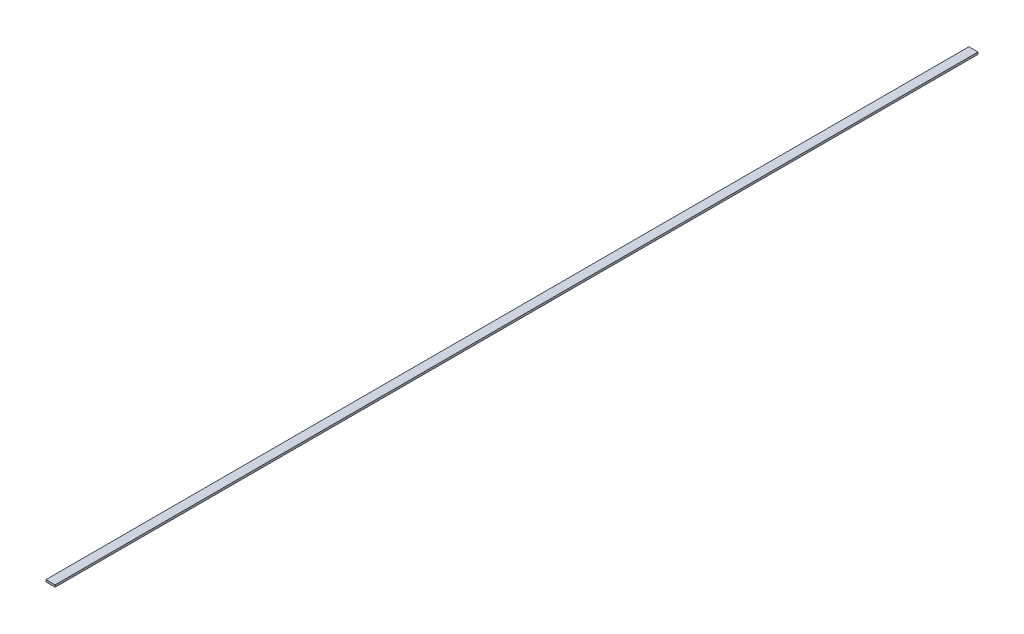
ISO-10303-21;
HEADER;
FILE_DESCRIPTION(('STEP AP214'),'2;1');
FILE_NAME('part.step','',(''),(''),'','','');
FILE_SCHEMA(('AUTOMOTIVE_DESIGN { 1 0 10303 214 1 1 1 1 }'));
ENDSEC;
DATA;
#1=APPLICATION_CONTEXT('core data for automotive mechanical design processes');
#2=APPLICATION_PROTOCOL_DEFINITION('international standard','automotive_design',2000,#1);
#3=PRODUCT_CONTEXT('',#1,'mechanical');
#4=PRODUCT('Part','Part','',(#3));
#5=PRODUCT_RELATED_PRODUCT_CATEGORY('part','',(#4));
#6=PRODUCT_DEFINITION_FORMATION('','',#4);
#7=PRODUCT_DEFINITION_CONTEXT('part definition',#1,'design');
#8=PRODUCT_DEFINITION('design','',#6,#7);
#9=PRODUCT_DEFINITION_SHAPE('','',#8);
#10=(LENGTH_UNIT() NAMED_UNIT(*) SI_UNIT(.MILLI.,.METRE.));
#11=(NAMED_UNIT(*) PLANE_ANGLE_UNIT() SI_UNIT($,.RADIAN.));
#12=(NAMED_UNIT(*) SI_UNIT($,.STERADIAN.) SOLID_ANGLE_UNIT());
#13=UNCERTAINTY_MEASURE_WITH_UNIT(LENGTH_MEASURE(1.E-05),#10,'distance_accuracy_value','');
#14=(GEOMETRIC_REPRESENTATION_CONTEXT(3) GLOBAL_UNCERTAINTY_ASSIGNED_CONTEXT((#13)) GLOBAL_UNIT_ASSIGNED_CONTEXT((#10,
#11,#12)) REPRESENTATION_CONTEXT('',''));
#15=CARTESIAN_POINT('',(0.,0.,0.));
#16=DIRECTION('',(0.,0.,1.));
#17=DIRECTION('',(1.,0.,0.));
#18=AXIS2_PLACEMENT_3D('',#15,#16,#17);
#19=CARTESIAN_POINT('',(-1.499997,0.350011999999999,304.8));
#20=DIRECTION('',(1.,0.,0.));
#21=DIRECTION('',(0.,0.,-1.));
#22=AXIS2_PLACEMENT_3D('',#19,#20,#21);
#23=PLANE('',#22);
#24=DIRECTION('',(0.,-1.,0.));
#25=VECTOR('',#24,1.);
#26=CARTESIAN_POINT('',(-1.499997,0.350011999999999,0.));
#27=LINE('',#26,#25);
#28=CARTESIAN_POINT('',(-1.499997,0.350011999999999,0.));
#29=VERTEX_POINT('',#28);
#30=CARTESIAN_POINT('',(-1.499997,-0.350012,0.));
#31=VERTEX_POINT('',#30);
#32=EDGE_CURVE('E107',#29,#31,#27,.T.);
#33=ORIENTED_EDGE('',*,*,#32,.T.);
#34=DIRECTION('',(0.,0.,-1.));
#35=VECTOR('',#34,1.);
#36=CARTESIAN_POINT('',(-1.499997,-0.350012,304.8));
#37=LINE('',#36,#35);
#38=CARTESIAN_POINT('',(-1.499997,-0.350012,304.8));
#39=VERTEX_POINT('',#38);
#40=EDGE_CURVE('E11',#39,#31,#37,.T.);
#41=ORIENTED_EDGE('',*,*,#40,.F.);
#42=DIRECTION('',(0.,-1.,0.));
#43=VECTOR('',#42,1.);
#44=CARTESIAN_POINT('',(-1.499997,0.350011999999999,304.8));
#45=LINE('',#44,#43);
#46=CARTESIAN_POINT('',(-1.499997,0.350011999999999,304.8));
#47=VERTEX_POINT('',#46);
#48=EDGE_CURVE('E91',#47,#39,#45,.T.);
#49=ORIENTED_EDGE('',*,*,#48,.F.);
#50=DIRECTION('',(0.,0.,-1.));
#51=VECTOR('',#50,1.);
#52=CARTESIAN_POINT('',(-1.499997,0.350011999999999,304.8));
#53=LINE('',#52,#51);
#54=EDGE_CURVE('E103',#47,#29,#53,.T.);
#55=ORIENTED_EDGE('',*,*,#54,.T.);
#56=EDGE_LOOP('',(#33,#41,#49,#55));
#57=FACE_BOUND('',#56,.T.);
#58=ADVANCED_FACE('F39',(#57),#23,.F.);
#59=CARTESIAN_POINT('',(-1.499997,-0.350012,304.8));
#60=DIRECTION('',(0.,1.,0.));
#61=DIRECTION('',(0.,0.,1.));
#62=AXIS2_PLACEMENT_3D('',#59,#60,#61);
#63=PLANE('',#62);
#64=DIRECTION('',(1.,0.,0.));
#65=VECTOR('',#64,1.);
#66=CARTESIAN_POINT('',(-1.499997,-0.350012,0.));
#67=LINE('',#66,#65);
#68=CARTESIAN_POINT('',(1.499997,-0.350012,0.));
#69=VERTEX_POINT('',#68);
#70=EDGE_CURVE('E96',#31,#69,#67,.T.);
#71=ORIENTED_EDGE('',*,*,#70,.T.);
#72=DIRECTION('',(0.,0.,-1.));
#73=VECTOR('',#72,1.);
#74=CARTESIAN_POINT('',(1.499997,-0.350012,304.8));
#75=LINE('',#74,#73);
#76=CARTESIAN_POINT('',(1.499997,-0.350012,304.8));
#77=VERTEX_POINT('',#76);
#78=EDGE_CURVE('E48',#77,#69,#75,.T.);
#79=ORIENTED_EDGE('',*,*,#78,.F.);
#80=DIRECTION('',(1.,0.,0.));
#81=VECTOR('',#80,1.);
#82=CARTESIAN_POINT('',(-1.499997,-0.350012,304.8));
#83=LINE('',#82,#81);
#84=EDGE_CURVE('E86',#39,#77,#83,.T.);
#85=ORIENTED_EDGE('',*,*,#84,.F.);
#86=ORIENTED_EDGE('',*,*,#40,.T.);
#87=EDGE_LOOP('',(#71,#79,#85,#86));
#88=FACE_BOUND('',#87,.T.);
#89=ADVANCED_FACE('F95',(#88),#63,.F.);
#90=CARTESIAN_POINT('',(1.499997,0.350012,304.8));
#91=DIRECTION('',(-1.,0.,0.));
#92=DIRECTION('',(0.,0.,1.));
#93=AXIS2_PLACEMENT_3D('',#90,#91,#92);
#94=PLANE('',#93);
#95=DIRECTION('',(0.,1.,0.));
#96=VECTOR('',#95,1.);
#97=CARTESIAN_POINT('',(1.499997,0.350012,0.));
#98=LINE('',#97,#96);
#99=CARTESIAN_POINT('',(1.499997,0.350012,0.));
#100=VERTEX_POINT('',#99);
#101=EDGE_CURVE('E73',#69,#100,#98,.T.);
#102=ORIENTED_EDGE('',*,*,#101,.T.);
#103=DIRECTION('',(0.,0.,-1.));
#104=VECTOR('',#103,1.);
#105=CARTESIAN_POINT('',(1.499997,0.350012,304.8));
#106=LINE('',#105,#104);
#107=CARTESIAN_POINT('',(1.499997,0.350012,304.8));
#108=VERTEX_POINT('',#107);
#109=EDGE_CURVE('E98',#108,#100,#106,.T.);
#110=ORIENTED_EDGE('',*,*,#109,.F.);
#111=DIRECTION('',(0.,1.,0.));
#112=VECTOR('',#111,1.);
#113=CARTESIAN_POINT('',(1.499997,0.350012,304.8));
#114=LINE('',#113,#112);
#115=EDGE_CURVE('E89',#77,#108,#114,.T.);
#116=ORIENTED_EDGE('',*,*,#115,.F.);
#117=ORIENTED_EDGE('',*,*,#78,.T.);
#118=EDGE_LOOP('',(#102,#110,#116,#117));
#119=FACE_BOUND('',#118,.T.);
#120=ADVANCED_FACE('F99',(#119),#94,.F.);
#121=CARTESIAN_POINT('',(-1.499997,0.350011999999999,304.8));
#122=DIRECTION('',(0.,-1.,0.));
#123=DIRECTION('',(1.,0.,0.));
#124=AXIS2_PLACEMENT_3D('',#121,#122,#123);
#125=PLANE('',#124);
#126=DIRECTION('',(-1.,0.,0.));
#127=VECTOR('',#126,1.);
#128=CARTESIAN_POINT('',(-1.499997,0.350011999999999,0.));
#129=LINE('',#128,#127);
#130=EDGE_CURVE('E79',#100,#29,#129,.T.);
#131=ORIENTED_EDGE('',*,*,#130,.T.);
#132=ORIENTED_EDGE('',*,*,#54,.F.);
#133=DIRECTION('',(-1.,0.,0.));
#134=VECTOR('',#133,1.);
#135=CARTESIAN_POINT('',(-1.499997,0.350011999999999,304.8));
#136=LINE('',#135,#134);
#137=EDGE_CURVE('E56',#108,#47,#136,.T.);
#138=ORIENTED_EDGE('',*,*,#137,.F.);
#139=ORIENTED_EDGE('',*,*,#109,.T.);
#140=EDGE_LOOP('',(#131,#132,#138,#139));
#141=FACE_BOUND('',#140,.T.);
#142=ADVANCED_FACE('F120',(#141),#125,.F.);
#143=CARTESIAN_POINT('',(0.,0.,304.8));
#144=DIRECTION('',(0.,0.,1.));
#145=DIRECTION('',(1.,0.,0.));
#146=AXIS2_PLACEMENT_3D('',#143,#144,#145);
#147=PLANE('',#146);
#148=ORIENTED_EDGE('',*,*,#48,.T.);
#149=ORIENTED_EDGE('',*,*,#84,.T.);
#150=ORIENTED_EDGE('',*,*,#115,.T.);
#151=ORIENTED_EDGE('',*,*,#137,.T.);
#152=EDGE_LOOP('',(#148,#149,#150,#151));
#153=FACE_BOUND('',#152,.T.);
#154=ADVANCED_FACE('F87',(#153),#147,.T.);
#155=CARTESIAN_POINT('',(0.,0.,0.));
#156=DIRECTION('',(0.,0.,1.));
#157=DIRECTION('',(1.,0.,0.));
#158=AXIS2_PLACEMENT_3D('',#155,#156,#157);
#159=PLANE('',#158);
#160=ORIENTED_EDGE('',*,*,#32,.F.);
#161=ORIENTED_EDGE('',*,*,#130,.F.);
#162=ORIENTED_EDGE('',*,*,#101,.F.);
#163=ORIENTED_EDGE('',*,*,#70,.F.);
#164=EDGE_LOOP('',(#160,#161,#162,#163));
#165=FACE_BOUND('',#164,.T.);
#166=ADVANCED_FACE('F123',(#165),#159,.F.);
#167=CLOSED_SHELL('',(#58,#89,#120,#142,#154,#166));
#168=MANIFOLD_SOLID_BREP('B2',#167);
#169=ADVANCED_BREP_SHAPE_REPRESENTATION('',(#18,#168),#14);
#170=SHAPE_DEFINITION_REPRESENTATION(#9,#169);
ENDSEC;
END-ISO-10303-21;
